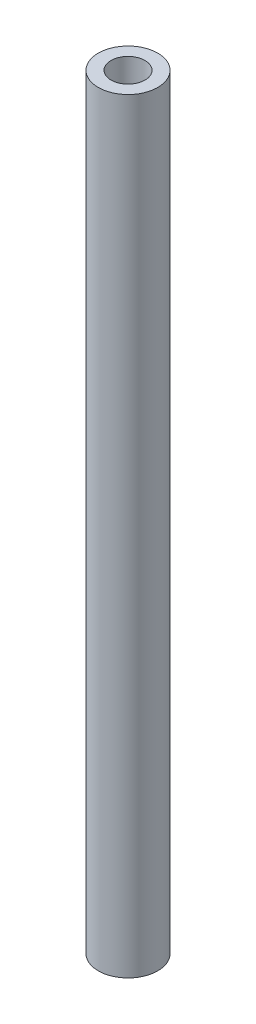
ISO-10303-21;
HEADER;
FILE_DESCRIPTION(('STEP AP214'),'2;1');
FILE_NAME('part.step','',(''),(''),'','','');
FILE_SCHEMA(('AUTOMOTIVE_DESIGN { 1 0 10303 214 1 1 1 1 }'));
ENDSEC;
DATA;
#1=APPLICATION_CONTEXT('core data for automotive mechanical design processes');
#2=APPLICATION_PROTOCOL_DEFINITION('international standard','automotive_design',2000,#1);
#3=PRODUCT_CONTEXT('',#1,'mechanical');
#4=PRODUCT('Part','Part','',(#3));
#5=PRODUCT_RELATED_PRODUCT_CATEGORY('part','',(#4));
#6=PRODUCT_DEFINITION_FORMATION('','',#4);
#7=PRODUCT_DEFINITION_CONTEXT('part definition',#1,'design');
#8=PRODUCT_DEFINITION('design','',#6,#7);
#9=PRODUCT_DEFINITION_SHAPE('','',#8);
#10=(LENGTH_UNIT() NAMED_UNIT(*) SI_UNIT(.MILLI.,.METRE.));
#11=(NAMED_UNIT(*) PLANE_ANGLE_UNIT() SI_UNIT($,.RADIAN.));
#12=(NAMED_UNIT(*) SI_UNIT($,.STERADIAN.) SOLID_ANGLE_UNIT());
#13=UNCERTAINTY_MEASURE_WITH_UNIT(LENGTH_MEASURE(1.E-05),#10,'distance_accuracy_value','');
#14=(GEOMETRIC_REPRESENTATION_CONTEXT(3) GLOBAL_UNCERTAINTY_ASSIGNED_CONTEXT((#13)) GLOBAL_UNIT_ASSIGNED_CONTEXT((#10,
#11,#12)) REPRESENTATION_CONTEXT('',''));
#15=CARTESIAN_POINT('',(0.,0.,0.));
#16=DIRECTION('',(0.,0.,1.));
#17=DIRECTION('',(1.,0.,0.));
#18=AXIS2_PLACEMENT_3D('',#15,#16,#17);
#19=CARTESIAN_POINT('',(0.,45.,0.));
#20=DIRECTION('',(0.,1.,0.));
#21=DIRECTION('',(0.,0.,1.));
#22=AXIS2_PLACEMENT_3D('',#19,#20,#21);
#23=PLANE('',#22);
#24=CARTESIAN_POINT('',(0.,45.,0.));
#25=DIRECTION('',(0.,1.,0.));
#26=DIRECTION('',(0.,0.,1.));
#27=AXIS2_PLACEMENT_3D('',#24,#25,#26);
#28=CIRCLE('',#27,1.75);
#29=CARTESIAN_POINT('',(0.,45.,-1.75));
#30=VERTEX_POINT('',#29);
#31=EDGE_CURVE('E10',#30,#30,#28,.T.);
#32=ORIENTED_EDGE('',*,*,#31,.T.);
#33=EDGE_LOOP('',(#32));
#34=FACE_BOUND('',#33,.T.);
#35=CARTESIAN_POINT('',(0.,45.,0.));
#36=DIRECTION('',(0.,1.,0.));
#37=DIRECTION('',(0.,0.,1.));
#38=AXIS2_PLACEMENT_3D('',#35,#36,#37);
#39=CIRCLE('',#38,1.);
#40=CARTESIAN_POINT('',(0.,45.,-1.));
#41=VERTEX_POINT('',#40);
#42=EDGE_CURVE('E54',#41,#41,#39,.T.);
#43=ORIENTED_EDGE('',*,*,#42,.F.);
#44=EDGE_LOOP('',(#43));
#45=FACE_BOUND('',#44,.T.);
#46=ADVANCED_FACE('F41',(#34,#45),#23,.T.);
#47=CARTESIAN_POINT('',(0.,0.,0.));
#48=DIRECTION('',(0.,1.,0.));
#49=DIRECTION('',(0.,0.,1.));
#50=AXIS2_PLACEMENT_3D('',#47,#48,#49);
#51=PLANE('',#50);
#52=CARTESIAN_POINT('',(0.,0.,0.));
#53=DIRECTION('',(0.,1.,0.));
#54=DIRECTION('',(0.,0.,1.));
#55=AXIS2_PLACEMENT_3D('',#52,#53,#54);
#56=CIRCLE('',#55,1.75);
#57=CARTESIAN_POINT('',(0.,0.,-1.75));
#58=VERTEX_POINT('',#57);
#59=EDGE_CURVE('E45',#58,#58,#56,.T.);
#60=ORIENTED_EDGE('',*,*,#59,.F.);
#61=EDGE_LOOP('',(#60));
#62=FACE_BOUND('',#61,.T.);
#63=CARTESIAN_POINT('',(0.,0.,0.));
#64=DIRECTION('',(0.,1.,0.));
#65=DIRECTION('',(0.,0.,1.));
#66=AXIS2_PLACEMENT_3D('',#63,#64,#65);
#67=CIRCLE('',#66,1.);
#68=CARTESIAN_POINT('',(0.,0.,-1.));
#69=VERTEX_POINT('',#68);
#70=EDGE_CURVE('E56',#69,#69,#67,.T.);
#71=ORIENTED_EDGE('',*,*,#70,.T.);
#72=EDGE_LOOP('',(#71));
#73=FACE_BOUND('',#72,.T.);
#74=ADVANCED_FACE('F68',(#62,#73),#51,.F.);
#75=CARTESIAN_POINT('',(0.,45.,0.));
#76=DIRECTION('',(0.,-1.,0.));
#77=DIRECTION('',(0.,0.,-1.));
#78=AXIS2_PLACEMENT_3D('',#75,#76,#77);
#79=CYLINDRICAL_SURFACE('',#78,1.75);
#80=CARTESIAN_POINT('',(0.,45.,-1.75));
#81=CARTESIAN_POINT('',(0.,44.53125,-1.75));
#82=CARTESIAN_POINT('',(0.,44.0625,-1.75));
#83=CARTESIAN_POINT('',(0.,43.125,-1.75));
#84=CARTESIAN_POINT('',(0.,42.65625,-1.75));
#85=CARTESIAN_POINT('',(0.,41.71875,-1.75));
#86=CARTESIAN_POINT('',(0.,41.25,-1.75));
#87=CARTESIAN_POINT('',(0.,40.3125,-1.75));
#88=CARTESIAN_POINT('',(0.,39.84375,-1.75));
#89=CARTESIAN_POINT('',(0.,38.90625,-1.75));
#90=CARTESIAN_POINT('',(0.,38.4375,-1.75));
#91=CARTESIAN_POINT('',(0.,37.5,-1.75));
#92=CARTESIAN_POINT('',(0.,37.03125,-1.75));
#93=CARTESIAN_POINT('',(0.,36.09375,-1.75));
#94=CARTESIAN_POINT('',(0.,35.625,-1.75));
#95=CARTESIAN_POINT('',(0.,34.6875,-1.75));
#96=CARTESIAN_POINT('',(0.,34.21875,-1.75));
#97=CARTESIAN_POINT('',(0.,33.28125,-1.75));
#98=CARTESIAN_POINT('',(0.,32.8125,-1.75));
#99=CARTESIAN_POINT('',(0.,31.875,-1.75));
#100=CARTESIAN_POINT('',(0.,31.40625,-1.75));
#101=CARTESIAN_POINT('',(0.,30.46875,-1.75));
#102=CARTESIAN_POINT('',(0.,30.,-1.75));
#103=CARTESIAN_POINT('',(0.,29.0625,-1.75));
#104=CARTESIAN_POINT('',(0.,28.59375,-1.75));
#105=CARTESIAN_POINT('',(0.,27.65625,-1.75));
#106=CARTESIAN_POINT('',(0.,27.1875,-1.75));
#107=CARTESIAN_POINT('',(0.,26.25,-1.75));
#108=CARTESIAN_POINT('',(0.,25.78125,-1.75));
#109=CARTESIAN_POINT('',(0.,24.84375,-1.75));
#110=CARTESIAN_POINT('',(0.,24.375,-1.75));
#111=CARTESIAN_POINT('',(0.,23.4375,-1.75));
#112=CARTESIAN_POINT('',(0.,22.96875,-1.75));
#113=CARTESIAN_POINT('',(0.,22.03125,-1.75));
#114=CARTESIAN_POINT('',(0.,21.5625,-1.75));
#115=CARTESIAN_POINT('',(0.,20.625,-1.75));
#116=CARTESIAN_POINT('',(0.,20.15625,-1.75));
#117=CARTESIAN_POINT('',(0.,19.21875,-1.75));
#118=CARTESIAN_POINT('',(0.,18.75,-1.75));
#119=CARTESIAN_POINT('',(0.,17.8125,-1.75));
#120=CARTESIAN_POINT('',(0.,17.34375,-1.75));
#121=CARTESIAN_POINT('',(0.,16.40625,-1.75));
#122=CARTESIAN_POINT('',(0.,15.9375,-1.75));
#123=CARTESIAN_POINT('',(0.,15.,-1.75));
#124=CARTESIAN_POINT('',(0.,14.53125,-1.75));
#125=CARTESIAN_POINT('',(0.,13.59375,-1.75));
#126=CARTESIAN_POINT('',(0.,13.125,-1.75));
#127=CARTESIAN_POINT('',(0.,12.1875,-1.75));
#128=CARTESIAN_POINT('',(0.,11.71875,-1.75));
#129=CARTESIAN_POINT('',(0.,10.78125,-1.75));
#130=CARTESIAN_POINT('',(0.,10.3125,-1.75));
#131=CARTESIAN_POINT('',(0.,9.37499999999999,-1.75));
#132=CARTESIAN_POINT('',(0.,8.90624999999999,-1.75));
#133=CARTESIAN_POINT('',(0.,7.96874999999999,-1.75));
#134=CARTESIAN_POINT('',(0.,7.5,-1.75));
#135=CARTESIAN_POINT('',(0.,6.56249999999999,-1.75));
#136=CARTESIAN_POINT('',(0.,6.09374999999999,-1.75));
#137=CARTESIAN_POINT('',(0.,5.15624999999999,-1.75));
#138=CARTESIAN_POINT('',(0.,4.68749999999999,-1.75));
#139=CARTESIAN_POINT('',(0.,3.74999999999999,-1.75));
#140=CARTESIAN_POINT('',(0.,3.28124999999999,-1.75));
#141=CARTESIAN_POINT('',(0.,2.34374999999999,-1.75));
#142=CARTESIAN_POINT('',(0.,1.87499999999999,-1.75));
#143=CARTESIAN_POINT('',(0.,0.937499999999992,-1.75));
#144=CARTESIAN_POINT('',(0.,0.468749999999993,-1.75));
#145=CARTESIAN_POINT('',(0.,0.,-1.75));
#146=B_SPLINE_CURVE_WITH_KNOTS('',3,(#80,#81,#82,#83,#84,#85,#86,#87,#88,#89,#90,#91,#92,#93,
#94,#95,#96,#97,#98,#99,#100,#101,#102,#103,#104,#105,#106,#107,#108,#109,#110,#111,#112,#113,
#114,#115,#116,#117,#118,#119,#120,#121,#122,#123,#124,#125,#126,#127,#128,#129,#130,#131,#132,
#133,#134,#135,#136,#137,#138,#139,#140,#141,#142,#143,#144,#145),.UNSPECIFIED.,.F.,.F.,(4,2,2,
2,2,2,2,2,2,2,2,2,2,2,2,2,2,2,2,2,2,2,2,2,2,2,2,2,2,2,2,2,4),(0.,1.40625,2.8125,
4.21874999999999,5.625,7.03125,8.43749999999999,9.84375,11.25,12.65625,14.0625,15.46875,16.875,
18.28125,19.6875,21.09375,22.5,23.90625,25.3125,26.71875,28.125,29.53125,30.9375,32.34375,33.75,
35.15625,36.5625,37.96875,39.375,40.78125,42.1875,43.59375,45.),.UNSPECIFIED.);
#147=EDGE_CURVE('BSEAM43',#30,#58,#146,.T.);
#148=ORIENTED_EDGE('',*,*,#31,.F.);
#149=ORIENTED_EDGE('',*,*,#59,.T.);
#150=ORIENTED_EDGE('',*,*,#147,.T.);
#151=ORIENTED_EDGE('',*,*,#147,.F.);
#152=EDGE_LOOP('',(#148,#150,#149,#151));
#153=FACE_BOUND('',#152,.T.);
#154=ADVANCED_FACE('F43',(#153),#79,.T.);
#155=CARTESIAN_POINT('',(0.,45.,0.));
#156=DIRECTION('',(0.,-1.,0.));
#157=DIRECTION('',(0.,0.,-1.));
#158=AXIS2_PLACEMENT_3D('',#155,#156,#157);
#159=CYLINDRICAL_SURFACE('',#158,1.);
#160=CARTESIAN_POINT('',(0.,45.,-1.));
#161=CARTESIAN_POINT('',(0.,44.53125,-1.));
#162=CARTESIAN_POINT('',(0.,44.0625,-1.));
#163=CARTESIAN_POINT('',(0.,43.125,-1.));
#164=CARTESIAN_POINT('',(0.,42.65625,-1.));
#165=CARTESIAN_POINT('',(0.,41.71875,-1.));
#166=CARTESIAN_POINT('',(0.,41.25,-1.));
#167=CARTESIAN_POINT('',(0.,40.3125,-1.));
#168=CARTESIAN_POINT('',(0.,39.84375,-1.));
#169=CARTESIAN_POINT('',(0.,38.90625,-1.));
#170=CARTESIAN_POINT('',(0.,38.4375,-1.));
#171=CARTESIAN_POINT('',(0.,37.5,-1.));
#172=CARTESIAN_POINT('',(0.,37.03125,-1.));
#173=CARTESIAN_POINT('',(0.,36.09375,-1.));
#174=CARTESIAN_POINT('',(0.,35.625,-1.));
#175=CARTESIAN_POINT('',(0.,34.6875,-1.));
#176=CARTESIAN_POINT('',(0.,34.21875,-1.));
#177=CARTESIAN_POINT('',(0.,33.28125,-1.));
#178=CARTESIAN_POINT('',(0.,32.8125,-1.));
#179=CARTESIAN_POINT('',(0.,31.875,-1.));
#180=CARTESIAN_POINT('',(0.,31.40625,-1.));
#181=CARTESIAN_POINT('',(0.,30.46875,-1.));
#182=CARTESIAN_POINT('',(0.,30.,-1.));
#183=CARTESIAN_POINT('',(0.,29.0625,-1.));
#184=CARTESIAN_POINT('',(0.,28.59375,-1.));
#185=CARTESIAN_POINT('',(0.,27.65625,-1.));
#186=CARTESIAN_POINT('',(0.,27.1875,-1.));
#187=CARTESIAN_POINT('',(0.,26.25,-1.));
#188=CARTESIAN_POINT('',(0.,25.78125,-1.));
#189=CARTESIAN_POINT('',(0.,24.84375,-1.));
#190=CARTESIAN_POINT('',(0.,24.375,-1.));
#191=CARTESIAN_POINT('',(0.,23.4375,-1.));
#192=CARTESIAN_POINT('',(0.,22.96875,-1.));
#193=CARTESIAN_POINT('',(0.,22.03125,-1.));
#194=CARTESIAN_POINT('',(0.,21.5625,-1.));
#195=CARTESIAN_POINT('',(0.,20.625,-1.));
#196=CARTESIAN_POINT('',(0.,20.15625,-1.));
#197=CARTESIAN_POINT('',(0.,19.21875,-1.));
#198=CARTESIAN_POINT('',(0.,18.75,-1.));
#199=CARTESIAN_POINT('',(0.,17.8125,-1.));
#200=CARTESIAN_POINT('',(0.,17.34375,-1.));
#201=CARTESIAN_POINT('',(0.,16.40625,-1.));
#202=CARTESIAN_POINT('',(0.,15.9375,-1.));
#203=CARTESIAN_POINT('',(0.,15.,-1.));
#204=CARTESIAN_POINT('',(0.,14.53125,-1.));
#205=CARTESIAN_POINT('',(0.,13.59375,-1.));
#206=CARTESIAN_POINT('',(0.,13.125,-1.));
#207=CARTESIAN_POINT('',(0.,12.1875,-1.));
#208=CARTESIAN_POINT('',(0.,11.71875,-1.));
#209=CARTESIAN_POINT('',(0.,10.78125,-1.));
#210=CARTESIAN_POINT('',(0.,10.3125,-1.));
#211=CARTESIAN_POINT('',(0.,9.37499999999999,-1.));
#212=CARTESIAN_POINT('',(0.,8.90624999999999,-1.));
#213=CARTESIAN_POINT('',(0.,7.96874999999999,-1.));
#214=CARTESIAN_POINT('',(0.,7.5,-1.));
#215=CARTESIAN_POINT('',(0.,6.56249999999999,-1.));
#216=CARTESIAN_POINT('',(0.,6.09374999999999,-1.));
#217=CARTESIAN_POINT('',(0.,5.15624999999999,-1.));
#218=CARTESIAN_POINT('',(0.,4.68749999999999,-1.));
#219=CARTESIAN_POINT('',(0.,3.74999999999999,-1.));
#220=CARTESIAN_POINT('',(0.,3.28124999999999,-1.));
#221=CARTESIAN_POINT('',(0.,2.34374999999999,-1.));
#222=CARTESIAN_POINT('',(0.,1.87499999999999,-1.));
#223=CARTESIAN_POINT('',(0.,0.937499999999992,-1.));
#224=CARTESIAN_POINT('',(0.,0.468749999999993,-1.));
#225=CARTESIAN_POINT('',(0.,0.,-1.));
#226=B_SPLINE_CURVE_WITH_KNOTS('',3,(#160,#161,#162,#163,#164,#165,#166,#167,#168,#169,#170,
#171,#172,#173,#174,#175,#176,#177,#178,#179,#180,#181,#182,#183,#184,#185,#186,#187,#188,#189,
#190,#191,#192,#193,#194,#195,#196,#197,#198,#199,#200,#201,#202,#203,#204,#205,#206,#207,#208,
#209,#210,#211,#212,#213,#214,#215,#216,#217,#218,#219,#220,#221,#222,#223,#224,#225),
.UNSPECIFIED.,.F.,.F.,(4,2,2,2,2,2,2,2,2,2,2,2,2,2,2,2,2,2,2,2,2,2,2,2,2,2,2,2,2,2,2,2,4),(0.,
1.40625,2.8125,4.21874999999999,5.625,7.03125,8.43749999999999,9.84375,11.25,12.65625,14.0625,
15.46875,16.875,18.28125,19.6875,21.09375,22.5,23.90625,25.3125,26.71875,28.125,29.53125,
30.9375,32.34375,33.75,35.15625,36.5625,37.96875,39.375,40.78125,42.1875,43.59375,45.),.UNSPECIFIED.);
#227=EDGE_CURVE('BSEAM64',#41,#69,#226,.T.);
#228=ORIENTED_EDGE('',*,*,#42,.T.);
#229=ORIENTED_EDGE('',*,*,#70,.F.);
#230=ORIENTED_EDGE('',*,*,#227,.T.);
#231=ORIENTED_EDGE('',*,*,#227,.F.);
#232=EDGE_LOOP('',(#228,#230,#229,#231));
#233=FACE_BOUND('',#232,.T.);
#234=ADVANCED_FACE('F64',(#233),#159,.F.);
#235=CLOSED_SHELL('',(#46,#74,#154,#234));
#236=MANIFOLD_SOLID_BREP('B2',#235);
#237=ADVANCED_BREP_SHAPE_REPRESENTATION('',(#18,#236),#14);
#238=SHAPE_DEFINITION_REPRESENTATION(#9,#237);
ENDSEC;
END-ISO-10303-21;
